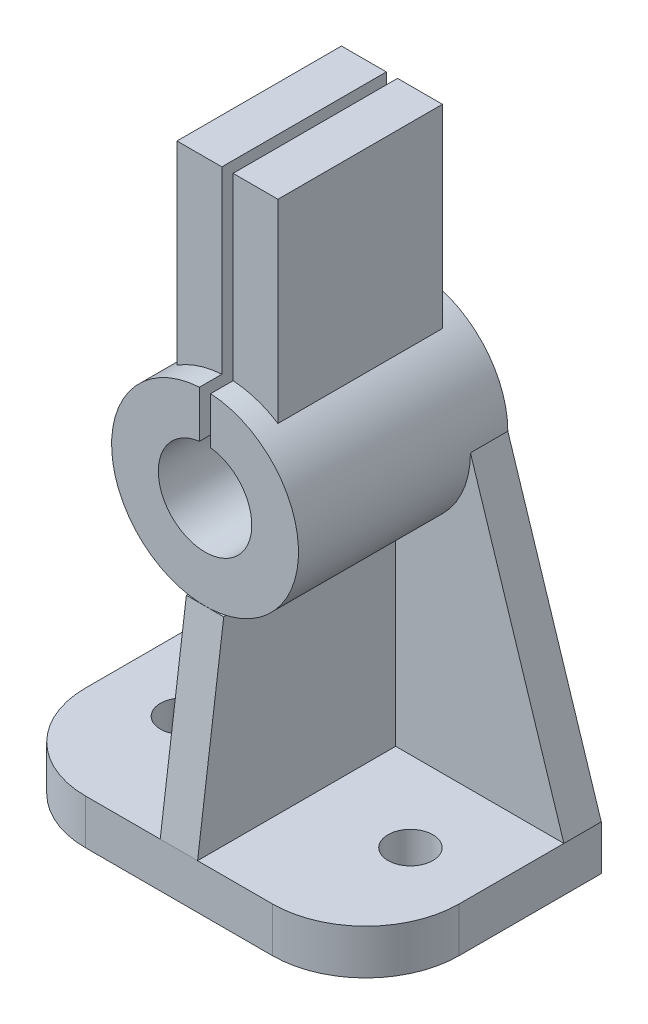
ISO-10303-21;
HEADER;
FILE_DESCRIPTION(('STEP AP214'),'2;1');
FILE_NAME('part.step','',(''),(''),'','','');
FILE_SCHEMA(('AUTOMOTIVE_DESIGN { 1 0 10303 214 1 1 1 1 }'));
ENDSEC;
DATA;
#1=APPLICATION_CONTEXT('core data for automotive mechanical design processes');
#2=APPLICATION_PROTOCOL_DEFINITION('international standard','automotive_design',2000,#1);
#3=PRODUCT_CONTEXT('',#1,'mechanical');
#4=PRODUCT('Part','Part','',(#3));
#5=PRODUCT_RELATED_PRODUCT_CATEGORY('part','',(#4));
#6=PRODUCT_DEFINITION_FORMATION('','',#4);
#7=PRODUCT_DEFINITION_CONTEXT('part definition',#1,'design');
#8=PRODUCT_DEFINITION('design','',#6,#7);
#9=PRODUCT_DEFINITION_SHAPE('','',#8);
#10=(LENGTH_UNIT() NAMED_UNIT(*) SI_UNIT(.MILLI.,.METRE.));
#11=(NAMED_UNIT(*) PLANE_ANGLE_UNIT() SI_UNIT($,.RADIAN.));
#12=(NAMED_UNIT(*) SI_UNIT($,.STERADIAN.) SOLID_ANGLE_UNIT());
#13=UNCERTAINTY_MEASURE_WITH_UNIT(LENGTH_MEASURE(1.E-05),#10,'distance_accuracy_value','');
#14=(GEOMETRIC_REPRESENTATION_CONTEXT(3) GLOBAL_UNCERTAINTY_ASSIGNED_CONTEXT((#13)) GLOBAL_UNIT_ASSIGNED_CONTEXT((#10,
#11,#12)) REPRESENTATION_CONTEXT('',''));
#15=CARTESIAN_POINT('',(0.,0.,0.));
#16=DIRECTION('',(0.,0.,1.));
#17=DIRECTION('',(1.,0.,0.));
#18=AXIS2_PLACEMENT_3D('',#15,#16,#17);
#19=CARTESIAN_POINT('',(-5.,65.,-21.5));
#20=DIRECTION('',(0.,-1.,0.));
#21=DIRECTION('',(0.,0.,-1.));
#22=AXIS2_PLACEMENT_3D('',#19,#20,#21);
#23=PLANE('',#22);
#24=DIRECTION('',(0.,0.,-1.));
#25=VECTOR('',#24,1.);
#26=CARTESIAN_POINT('',(5.,65.,-21.5));
#27=LINE('',#26,#25);
#28=CARTESIAN_POINT('',(5.,65.,24.5));
#29=VERTEX_POINT('',#28);
#30=CARTESIAN_POINT('',(5.,65.,-21.5));
#31=VERTEX_POINT('',#30);
#32=EDGE_CURVE('E106',#29,#31,#27,.T.);
#33=ORIENTED_EDGE('',*,*,#32,.T.);
#34=DIRECTION('',(1.,0.,0.));
#35=VECTOR('',#34,1.);
#36=CARTESIAN_POINT('',(-5.,65.,-21.5));
#37=LINE('',#36,#35);
#38=CARTESIAN_POINT('',(-5.,65.,-21.5));
#39=VERTEX_POINT('',#38);
#40=EDGE_CURVE('E12',#39,#31,#37,.T.);
#41=ORIENTED_EDGE('',*,*,#40,.F.);
#42=DIRECTION('',(0.,0.,-1.));
#43=VECTOR('',#42,1.);
#44=CARTESIAN_POINT('',(-5.,65.,-21.5));
#45=LINE('',#44,#43);
#46=CARTESIAN_POINT('',(-5.,65.,24.5));
#47=VERTEX_POINT('',#46);
#48=EDGE_CURVE('E94',#47,#39,#45,.T.);
#49=ORIENTED_EDGE('',*,*,#48,.F.);
#50=DIRECTION('',(1.,0.,0.));
#51=VECTOR('',#50,1.);
#52=CARTESIAN_POINT('',(-5.,65.,24.5));
#53=LINE('',#52,#51);
#54=EDGE_CURVE('E102',#47,#29,#53,.T.);
#55=ORIENTED_EDGE('',*,*,#54,.T.);
#56=EDGE_LOOP('',(#33,#41,#49,#55));
#57=FACE_BOUND('',#56,.T.);
#58=ADVANCED_FACE('F43',(#57),#23,.F.);
#59=CARTESIAN_POINT('',(-5.,12.,-21.5));
#60=DIRECTION('',(0.,0.,1.));
#61=DIRECTION('',(0.,-1.,0.));
#62=AXIS2_PLACEMENT_3D('',#59,#60,#61);
#63=PLANE('',#62);
#64=DIRECTION('',(0.,-1.,0.));
#65=VECTOR('',#64,1.);
#66=CARTESIAN_POINT('',(5.,12.,-21.5));
#67=LINE('',#66,#65);
#68=CARTESIAN_POINT('',(5.,12.,-21.5));
#69=VERTEX_POINT('',#68);
#70=EDGE_CURVE('E98',#31,#69,#67,.T.);
#71=ORIENTED_EDGE('',*,*,#70,.T.);
#72=DIRECTION('',(1.,0.,0.));
#73=VECTOR('',#72,1.);
#74=CARTESIAN_POINT('',(-5.,12.,-21.5));
#75=LINE('',#74,#73);
#76=CARTESIAN_POINT('',(-5.,12.,-21.5));
#77=VERTEX_POINT('',#76);
#78=EDGE_CURVE('E51',#77,#69,#75,.T.);
#79=ORIENTED_EDGE('',*,*,#78,.F.);
#80=DIRECTION('',(0.,-1.,0.));
#81=VECTOR('',#80,1.);
#82=CARTESIAN_POINT('',(-5.,12.,-21.5));
#83=LINE('',#82,#81);
#84=EDGE_CURVE('E89',#39,#77,#83,.T.);
#85=ORIENTED_EDGE('',*,*,#84,.F.);
#86=ORIENTED_EDGE('',*,*,#40,.T.);
#87=EDGE_LOOP('',(#71,#79,#85,#86));
#88=FACE_BOUND('',#87,.T.);
#89=ADVANCED_FACE('F97',(#88),#63,.F.);
#90=CARTESIAN_POINT('',(-5.,12.,31.5));
#91=DIRECTION('',(0.,1.,0.));
#92=DIRECTION('',(0.,0.,1.));
#93=AXIS2_PLACEMENT_3D('',#90,#91,#92);
#94=PLANE('',#93);
#95=DIRECTION('',(0.,0.,1.));
#96=VECTOR('',#95,1.);
#97=CARTESIAN_POINT('',(5.,12.,31.5));
#98=LINE('',#97,#96);
#99=CARTESIAN_POINT('',(5.,12.,31.5));
#100=VERTEX_POINT('',#99);
#101=EDGE_CURVE('E76',#69,#100,#98,.T.);
#102=ORIENTED_EDGE('',*,*,#101,.T.);
#103=DIRECTION('',(1.,0.,0.));
#104=VECTOR('',#103,1.);
#105=CARTESIAN_POINT('',(-5.,12.,31.5));
#106=LINE('',#105,#104);
#107=CARTESIAN_POINT('',(-5.,12.,31.5));
#108=VERTEX_POINT('',#107);
#109=EDGE_CURVE('E99',#108,#100,#106,.T.);
#110=ORIENTED_EDGE('',*,*,#109,.F.);
#111=DIRECTION('',(0.,0.,1.));
#112=VECTOR('',#111,1.);
#113=CARTESIAN_POINT('',(-5.,12.,31.5));
#114=LINE('',#113,#112);
#115=EDGE_CURVE('E92',#77,#108,#114,.T.);
#116=ORIENTED_EDGE('',*,*,#115,.F.);
#117=ORIENTED_EDGE('',*,*,#78,.T.);
#118=EDGE_LOOP('',(#102,#110,#116,#117));
#119=FACE_BOUND('',#118,.T.);
#120=ADVANCED_FACE('F100',(#119),#94,.F.);
#121=CARTESIAN_POINT('',(-5.,65.,24.5));
#122=DIRECTION('',(0.,-0.130938369254535,-0.991390510070055));
#123=DIRECTION('',(0.,0.991390510070055,-0.130938369254535));
#124=AXIS2_PLACEMENT_3D('',#121,#122,#123);
#125=PLANE('',#124);
#126=DIRECTION('',(0.,0.991390510070055,-0.130938369254535));
#127=VECTOR('',#126,1.);
#128=CARTESIAN_POINT('',(5.,65.,24.5));
#129=LINE('',#128,#127);
#130=EDGE_CURVE('E82',#100,#29,#129,.T.);
#131=ORIENTED_EDGE('',*,*,#130,.T.);
#132=ORIENTED_EDGE('',*,*,#54,.F.);
#133=DIRECTION('',(0.,0.991390510070055,-0.130938369254535));
#134=VECTOR('',#133,1.);
#135=CARTESIAN_POINT('',(-5.,65.,24.5));
#136=LINE('',#135,#134);
#137=EDGE_CURVE('E59',#108,#47,#136,.T.);
#138=ORIENTED_EDGE('',*,*,#137,.F.);
#139=ORIENTED_EDGE('',*,*,#109,.T.);
#140=EDGE_LOOP('',(#131,#132,#138,#139));
#141=FACE_BOUND('',#140,.T.);
#142=ADVANCED_FACE('F113',(#141),#125,.F.);
#143=CARTESIAN_POINT('',(-5.,0.,0.));
#144=DIRECTION('',(-1.,0.,0.));
#145=DIRECTION('',(0.,0.,1.));
#146=AXIS2_PLACEMENT_3D('',#143,#144,#145);
#147=PLANE('',#146);
#148=ORIENTED_EDGE('',*,*,#48,.T.);
#149=ORIENTED_EDGE('',*,*,#84,.T.);
#150=ORIENTED_EDGE('',*,*,#115,.T.);
#151=ORIENTED_EDGE('',*,*,#137,.T.);
#152=EDGE_LOOP('',(#148,#149,#150,#151));
#153=FACE_BOUND('',#152,.T.);
#154=ADVANCED_FACE('F90',(#153),#147,.T.);
#155=CARTESIAN_POINT('',(5.,0.,0.));
#156=DIRECTION('',(-1.,0.,0.));
#157=DIRECTION('',(0.,0.,1.));
#158=AXIS2_PLACEMENT_3D('',#155,#156,#157);
#159=PLANE('',#158);
#160=ORIENTED_EDGE('',*,*,#32,.F.);
#161=ORIENTED_EDGE('',*,*,#130,.F.);
#162=ORIENTED_EDGE('',*,*,#101,.F.);
#163=ORIENTED_EDGE('',*,*,#70,.F.);
#164=EDGE_LOOP('',(#160,#161,#162,#163));
#165=FACE_BOUND('',#164,.T.);
#166=ADVANCED_FACE('F116',(#165),#159,.F.);
#167=CLOSED_SHELL('',(#58,#89,#120,#142,#154,#166));
#168=MANIFOLD_SOLID_BREP('B2',#167);
#169=CARTESIAN_POINT('',(-13.5,-0.002000000000002,-25.5));
#170=DIRECTION('',(0.,0.,1.));
#171=DIRECTION('',(1.,0.,0.));
#172=AXIS2_PLACEMENT_3D('',#169,#170,#171);
#173=PLANE('',#172);
#174=DIRECTION('',(-1.,0.,0.));
#175=VECTOR('',#174,1.);
#176=CARTESIAN_POINT('',(-13.5,163.,-25.5));
#177=LINE('',#176,#175);
#178=CARTESIAN_POINT('',(-1.5,163.,-25.5));
#179=VERTEX_POINT('',#178);
#180=CARTESIAN_POINT('',(-13.5,163.,-25.5));
#181=VERTEX_POINT('',#180);
#182=EDGE_CURVE('E379',#179,#181,#177,.T.);
#183=ORIENTED_EDGE('',*,*,#182,.F.);
#184=DIRECTION('',(0.,-1.,0.));
#185=VECTOR('',#184,1.);
#186=CARTESIAN_POINT('',(-1.5,-0.002000000000002,-25.5));
#187=LINE('',#186,#185);
#188=CARTESIAN_POINT('',(-1.5,114.954959426936,-25.5));
#189=VERTEX_POINT('',#188);
#190=EDGE_CURVE('E364',#179,#189,#187,.T.);
#191=ORIENTED_EDGE('',*,*,#190,.T.);
#192=CARTESIAN_POINT('',(0.,90.,-25.5));
#193=DIRECTION('',(0.,0.,1.));
#194=DIRECTION('',(1.,0.,0.));
#195=AXIS2_PLACEMENT_3D('',#192,#193,#194);
#196=CIRCLE('',#195,25.);
#197=CARTESIAN_POINT('',(-13.5,111.041625412501,-25.5));
#198=VERTEX_POINT('',#197);
#199=EDGE_CURVE('E394',#189,#198,#196,.T.);
#200=ORIENTED_EDGE('',*,*,#199,.T.);
#201=DIRECTION('',(0.,1.,0.));
#202=VECTOR('',#201,1.);
#203=CARTESIAN_POINT('',(-13.5,-0.002000000000002,-25.5));
#204=LINE('',#203,#202);
#205=EDGE_CURVE('E389',#198,#181,#204,.T.);
#206=ORIENTED_EDGE('',*,*,#205,.T.);
#207=EDGE_LOOP('',(#183,#191,#200,#206));
#208=FACE_BOUND('',#207,.T.);
#209=ADVANCED_FACE('F167',(#208),#173,.F.);
#210=CARTESIAN_POINT('',(13.5,-0.002000000000002,18.5));
#211=DIRECTION('',(0.,0.,-1.));
#212=DIRECTION('',(-1.,0.,0.));
#213=AXIS2_PLACEMENT_3D('',#210,#211,#212);
#214=PLANE('',#213);
#215=CARTESIAN_POINT('',(0.,90.,18.5));
#216=DIRECTION('',(0.,0.,-1.));
#217=DIRECTION('',(-1.,0.,0.));
#218=AXIS2_PLACEMENT_3D('',#215,#216,#217);
#219=CIRCLE('',#218,25.);
#220=CARTESIAN_POINT('',(-13.5,111.041625412501,18.5));
#221=VERTEX_POINT('',#220);
#222=CARTESIAN_POINT('',(-1.5,114.954959426936,18.5));
#223=VERTEX_POINT('',#222);
#224=EDGE_CURVE('E401',#221,#223,#219,.T.);
#225=ORIENTED_EDGE('',*,*,#224,.T.);
#226=DIRECTION('',(0.,1.,0.));
#227=VECTOR('',#226,1.);
#228=CARTESIAN_POINT('',(-1.5,-0.002000000000002,18.5));
#229=LINE('',#228,#227);
#230=CARTESIAN_POINT('',(-1.5,163.,18.5));
#231=VERTEX_POINT('',#230);
#232=EDGE_CURVE('E355',#223,#231,#229,.T.);
#233=ORIENTED_EDGE('',*,*,#232,.T.);
#234=DIRECTION('',(1.,0.,0.));
#235=VECTOR('',#234,1.);
#236=CARTESIAN_POINT('',(-13.5,163.,18.5));
#237=LINE('',#236,#235);
#238=CARTESIAN_POINT('',(-13.5,163.,18.5));
#239=VERTEX_POINT('',#238);
#240=EDGE_CURVE('E374',#239,#231,#237,.T.);
#241=ORIENTED_EDGE('',*,*,#240,.F.);
#242=DIRECTION('',(0.,1.,0.));
#243=VECTOR('',#242,1.);
#244=CARTESIAN_POINT('',(-13.5,-0.002000000000002,18.5));
#245=LINE('',#244,#243);
#246=EDGE_CURVE('E392',#221,#239,#245,.T.);
#247=ORIENTED_EDGE('',*,*,#246,.F.);
#248=EDGE_LOOP('',(#225,#233,#241,#247));
#249=FACE_BOUND('',#248,.T.);
#250=ADVANCED_FACE('F554',(#249),#214,.F.);
#251=CARTESIAN_POINT('',(0.,163.,0.));
#252=DIRECTION('',(0.,1.,0.));
#253=DIRECTION('',(0.,0.,1.));
#254=AXIS2_PLACEMENT_3D('',#251,#252,#253);
#255=PLANE('',#254);
#256=DIRECTION('',(0.,0.,1.));
#257=VECTOR('',#256,1.);
#258=CARTESIAN_POINT('',(-1.5,163.,0.));
#259=LINE('',#258,#257);
#260=EDGE_CURVE('E41',#179,#231,#259,.T.);
#261=ORIENTED_EDGE('',*,*,#260,.F.);
#262=ORIENTED_EDGE('',*,*,#182,.T.);
#263=DIRECTION('',(0.,0.,1.));
#264=VECTOR('',#263,1.);
#265=CARTESIAN_POINT('',(-13.5,163.,-25.5));
#266=LINE('',#265,#264);
#267=EDGE_CURVE('E370',#181,#239,#266,.T.);
#268=ORIENTED_EDGE('',*,*,#267,.T.);
#269=ORIENTED_EDGE('',*,*,#240,.T.);
#270=EDGE_LOOP('',(#261,#262,#268,#269));
#271=FACE_BOUND('',#270,.T.);
#272=ADVANCED_FACE('F550',(#271),#255,.T.);
#273=CARTESIAN_POINT('',(0.,90.,-21.5));
#274=DIRECTION('',(0.,0.,-1.));
#275=DIRECTION('',(-1.,0.,0.));
#276=AXIS2_PLACEMENT_3D('',#273,#274,#275);
#277=CYLINDRICAL_SURFACE('',#276,25.);
#278=DIRECTION('',(0.,0.,-1.));
#279=VECTOR('',#278,1.);
#280=CARTESIAN_POINT('',(-1.5,114.954959426936,-21.5));
#281=LINE('',#280,#279);
#282=CARTESIAN_POINT('',(-1.5,114.954959426936,-31.5));
#283=VERTEX_POINT('',#282);
#284=EDGE_CURVE('E361',#283,#189,#281,.F.);
#285=ORIENTED_EDGE('',*,*,#284,.F.);
#286=CARTESIAN_POINT('',(0.,90.,-31.5));
#287=DIRECTION('',(0.,0.,-1.));
#288=DIRECTION('',(-1.,0.,0.));
#289=AXIS2_PLACEMENT_3D('',#286,#287,#288);
#290=CIRCLE('',#289,25.);
#291=CARTESIAN_POINT('',(-25.,90.,-31.5));
#292=VERTEX_POINT('',#291);
#293=EDGE_CURVE('E340',#292,#283,#290,.T.);
#294=ORIENTED_EDGE('',*,*,#293,.F.);
#295=DIRECTION('',(0.,0.,-1.));
#296=VECTOR('',#295,1.);
#297=CARTESIAN_POINT('',(-25.,90.,-21.5));
#298=LINE('',#297,#296);
#299=CARTESIAN_POINT('',(-25.,90.,-21.5));
#300=VERTEX_POINT('',#299);
#301=EDGE_CURVE('E437',#300,#292,#298,.T.);
#302=ORIENTED_EDGE('',*,*,#301,.F.);
#303=CARTESIAN_POINT('',(0.,90.,-21.5));
#304=DIRECTION('',(0.,0.,-1.));
#305=DIRECTION('',(-1.,0.,0.));
#306=AXIS2_PLACEMENT_3D('',#303,#304,#305);
#307=CIRCLE('',#306,25.);
#308=CARTESIAN_POINT('',(25.,90.,-21.5));
#309=VERTEX_POINT('',#308);
#310=EDGE_CURVE('E489',#309,#300,#307,.T.);
#311=ORIENTED_EDGE('',*,*,#310,.F.);
#312=DIRECTION('',(0.,0.,-1.));
#313=VECTOR('',#312,1.);
#314=CARTESIAN_POINT('',(25.,90.,-21.5));
#315=LINE('',#314,#313);
#316=CARTESIAN_POINT('',(25.,90.,-31.5));
#317=VERTEX_POINT('',#316);
#318=EDGE_CURVE('E431',#309,#317,#315,.T.);
#319=ORIENTED_EDGE('',*,*,#318,.T.);
#320=CARTESIAN_POINT('',(1.5,114.954959426936,-31.5));
#321=VERTEX_POINT('',#320);
#322=EDGE_CURVE('E422',#321,#317,#290,.T.);
#323=ORIENTED_EDGE('',*,*,#322,.F.);
#324=DIRECTION('',(0.,0.,-1.));
#325=VECTOR('',#324,1.);
#326=CARTESIAN_POINT('',(1.5,114.954959426936,-21.5));
#327=LINE('',#326,#325);
#328=CARTESIAN_POINT('',(1.5,114.954959426936,-25.5));
#329=VERTEX_POINT('',#328);
#330=EDGE_CURVE('E349',#329,#321,#327,.T.);
#331=ORIENTED_EDGE('',*,*,#330,.F.);
#332=CARTESIAN_POINT('',(13.5,111.041625412501,-25.5));
#333=VERTEX_POINT('',#332);
#334=EDGE_CURVE('E395',#333,#329,#196,.T.);
#335=ORIENTED_EDGE('',*,*,#334,.F.);
#336=DIRECTION('',(0.,0.,-1.));
#337=VECTOR('',#336,1.);
#338=CARTESIAN_POINT('',(13.5,111.041625412501,-21.5));
#339=LINE('',#338,#337);
#340=CARTESIAN_POINT('',(13.5,111.041625412501,18.5));
#341=VERTEX_POINT('',#340);
#342=EDGE_CURVE('E367',#341,#333,#339,.T.);
#343=ORIENTED_EDGE('',*,*,#342,.F.);
#344=CARTESIAN_POINT('',(1.5,114.954959426936,18.5));
#345=VERTEX_POINT('',#344);
#346=EDGE_CURVE('E400',#345,#341,#219,.T.);
#347=ORIENTED_EDGE('',*,*,#346,.F.);
#348=CARTESIAN_POINT('',(1.5,114.954959426936,24.5));
#349=VERTEX_POINT('',#348);
#350=EDGE_CURVE('E346',#349,#345,#327,.T.);
#351=ORIENTED_EDGE('',*,*,#350,.F.);
#352=CARTESIAN_POINT('',(0.,90.,24.5));
#353=DIRECTION('',(0.,0.,-1.));
#354=DIRECTION('',(-1.,0.,0.));
#355=AXIS2_PLACEMENT_3D('',#352,#353,#354);
#356=CIRCLE('',#355,25.);
#357=CARTESIAN_POINT('',(-1.5,114.954959426936,24.5));
#358=VERTEX_POINT('',#357);
#359=EDGE_CURVE('E419',#349,#358,#356,.T.);
#360=ORIENTED_EDGE('',*,*,#359,.T.);
#361=EDGE_CURVE('E358',#223,#358,#281,.F.);
#362=ORIENTED_EDGE('',*,*,#361,.F.);
#363=ORIENTED_EDGE('',*,*,#224,.F.);
#364=DIRECTION('',(0.,0.,-1.));
#365=VECTOR('',#364,1.);
#366=CARTESIAN_POINT('',(-13.5,111.041625412501,-21.5));
#367=LINE('',#366,#365);
#368=EDGE_CURVE('E398',#198,#221,#367,.F.);
#369=ORIENTED_EDGE('',*,*,#368,.F.);
#370=ORIENTED_EDGE('',*,*,#199,.F.);
#371=EDGE_LOOP('',(#285,#294,#302,#311,#319,#323,#331,#335,#343,#347,#351,#360,#362,#363,#369,#370));
#372=FACE_BOUND('',#371,.T.);
#373=ADVANCED_FACE('F506',(#372),#277,.T.);
#374=CARTESIAN_POINT('',(50.,12.,6.49999999999982));
#375=DIRECTION('',(-1.,0.,0.));
#376=DIRECTION('',(0.,0.,1.));
#377=AXIS2_PLACEMENT_3D('',#374,#375,#376);
#378=PLANE('',#377);
#379=DIRECTION('',(0.,0.,-1.));
#380=VECTOR('',#379,1.);
#381=CARTESIAN_POINT('',(50.,0.,6.49999999999982));
#382=LINE('',#381,#380);
#383=CARTESIAN_POINT('',(50.,0.,6.49999999999983));
#384=VERTEX_POINT('',#383);
#385=CARTESIAN_POINT('',(50.,0.,-31.5));
#386=VERTEX_POINT('',#385);
#387=EDGE_CURVE('E439',#384,#386,#382,.T.);
#388=ORIENTED_EDGE('',*,*,#387,.T.);
#389=DIRECTION('',(0.,-1.,0.));
#390=VECTOR('',#389,1.);
#391=CARTESIAN_POINT('',(50.,12.,-31.5));
#392=LINE('',#391,#390);
#393=CARTESIAN_POINT('',(50.,12.,-31.5));
#394=VERTEX_POINT('',#393);
#395=EDGE_CURVE('E483',#394,#386,#392,.T.);
#396=ORIENTED_EDGE('',*,*,#395,.F.);
#397=DIRECTION('',(0.,0.,-1.));
#398=VECTOR('',#397,1.);
#399=CARTESIAN_POINT('',(50.,12.,-21.5));
#400=LINE('',#399,#398);
#401=CARTESIAN_POINT('',(50.,12.,-21.5));
#402=VERTEX_POINT('',#401);
#403=EDGE_CURVE('E440',#402,#394,#400,.T.);
#404=ORIENTED_EDGE('',*,*,#403,.F.);
#405=DIRECTION('',(0.,0.,-1.));
#406=VECTOR('',#405,1.);
#407=CARTESIAN_POINT('',(50.,12.,6.49999999999982));
#408=LINE('',#407,#406);
#409=CARTESIAN_POINT('',(50.,12.,6.49999999999983));
#410=VERTEX_POINT('',#409);
#411=EDGE_CURVE('E444',#410,#402,#408,.T.);
#412=ORIENTED_EDGE('',*,*,#411,.F.);
#413=DIRECTION('',(0.,-1.,0.));
#414=VECTOR('',#413,1.);
#415=CARTESIAN_POINT('',(50.,12.,6.49999999999983));
#416=LINE('',#415,#414);
#417=EDGE_CURVE('E457',#410,#384,#416,.T.);
#418=ORIENTED_EDGE('',*,*,#417,.T.);
#419=EDGE_LOOP('',(#388,#396,#404,#412,#418));
#420=FACE_BOUND('',#419,.T.);
#421=ADVANCED_FACE('F169',(#420),#378,.F.);
#422=CARTESIAN_POINT('',(-50.,12.,-31.5));
#423=DIRECTION('',(0.,0.,1.));
#424=DIRECTION('',(1.,0.,0.));
#425=AXIS2_PLACEMENT_3D('',#422,#423,#424);
#426=PLANE('',#425);
#427=ORIENTED_EDGE('',*,*,#293,.T.);
#428=DIRECTION('',(0.,1.,0.));
#429=VECTOR('',#428,1.);
#430=CARTESIAN_POINT('',(-1.5,-0.001000000000001,-31.5));
#431=LINE('',#430,#429);
#432=CARTESIAN_POINT('',(-1.5,102.409673645991,-31.5));
#433=VERTEX_POINT('',#432);
#434=EDGE_CURVE('E318',#433,#283,#431,.T.);
#435=ORIENTED_EDGE('',*,*,#434,.F.);
#436=CARTESIAN_POINT('',(0.,90.,-31.5));
#437=DIRECTION('',(0.,0.,-1.));
#438=DIRECTION('',(-1.,0.,0.));
#439=AXIS2_PLACEMENT_3D('',#436,#437,#438);
#440=CIRCLE('',#439,12.5);
#441=CARTESIAN_POINT('',(1.50000000000001,102.409673645991,-31.5));
#442=VERTEX_POINT('',#441);
#443=EDGE_CURVE('E327',#433,#442,#440,.T.);
#444=ORIENTED_EDGE('',*,*,#443,.T.);
#445=DIRECTION('',(0.,1.,0.));
#446=VECTOR('',#445,1.);
#447=CARTESIAN_POINT('',(1.5,-0.001000000000001,-31.5));
#448=LINE('',#447,#446);
#449=EDGE_CURVE('E324',#442,#321,#448,.T.);
#450=ORIENTED_EDGE('',*,*,#449,.T.);
#451=ORIENTED_EDGE('',*,*,#322,.T.);
#452=DIRECTION('',(0.305218682064767,-0.952282288042073,0.));
#453=VECTOR('',#452,1.);
#454=CARTESIAN_POINT('',(25.,90.,-31.5));
#455=LINE('',#454,#453);
#456=EDGE_CURVE('E433',#317,#394,#455,.T.);
#457=ORIENTED_EDGE('',*,*,#456,.T.);
#458=ORIENTED_EDGE('',*,*,#395,.T.);
#459=DIRECTION('',(-1.,0.,0.));
#460=VECTOR('',#459,1.);
#461=CARTESIAN_POINT('',(-50.,0.,-31.5));
#462=LINE('',#461,#460);
#463=CARTESIAN_POINT('',(-50.,0.,-31.5));
#464=VERTEX_POINT('',#463);
#465=EDGE_CURVE('E460',#386,#464,#462,.T.);
#466=ORIENTED_EDGE('',*,*,#465,.T.);
#467=DIRECTION('',(0.,-1.,0.));
#468=VECTOR('',#467,1.);
#469=CARTESIAN_POINT('',(-50.,12.,-31.5));
#470=LINE('',#469,#468);
#471=CARTESIAN_POINT('',(-50.,12.,-31.5));
#472=VERTEX_POINT('',#471);
#473=EDGE_CURVE('E480',#472,#464,#470,.T.);
#474=ORIENTED_EDGE('',*,*,#473,.F.);
#475=DIRECTION('',(0.305218682064767,0.952282288042073,0.));
#476=VECTOR('',#475,1.);
#477=CARTESIAN_POINT('',(-50.,12.,-31.5));
#478=LINE('',#477,#476);
#479=EDGE_CURVE('E427',#472,#292,#478,.T.);
#480=ORIENTED_EDGE('',*,*,#479,.T.);
#481=EDGE_LOOP('',(#427,#435,#444,#450,#451,#457,#458,#466,#474,#480));
#482=FACE_BOUND('',#481,.T.);
#483=ADVANCED_FACE('F337',(#482),#426,.F.);
#484=CARTESIAN_POINT('',(-50.,12.,6.49999999999982));
#485=DIRECTION('',(1.,0.,0.));
#486=DIRECTION('',(0.,0.,-1.));
#487=AXIS2_PLACEMENT_3D('',#484,#485,#486);
#488=PLANE('',#487);
#489=DIRECTION('',(0.,0.,1.));
#490=VECTOR('',#489,1.);
#491=CARTESIAN_POINT('',(-50.,0.,6.49999999999982));
#492=LINE('',#491,#490);
#493=CARTESIAN_POINT('',(-50.,0.,6.49999999999982));
#494=VERTEX_POINT('',#493);
#495=EDGE_CURVE('E462',#464,#494,#492,.T.);
#496=ORIENTED_EDGE('',*,*,#495,.T.);
#497=DIRECTION('',(0.,-1.,0.));
#498=VECTOR('',#497,1.);
#499=CARTESIAN_POINT('',(-50.,12.,6.49999999999982));
#500=LINE('',#499,#498);
#501=CARTESIAN_POINT('',(-50.,12.,6.49999999999982));
#502=VERTEX_POINT('',#501);
#503=EDGE_CURVE('E477',#502,#494,#500,.T.);
#504=ORIENTED_EDGE('',*,*,#503,.F.);
#505=DIRECTION('',(0.,0.,1.));
#506=VECTOR('',#505,1.);
#507=CARTESIAN_POINT('',(-50.,12.,6.49999999999982));
#508=LINE('',#507,#506);
#509=CARTESIAN_POINT('',(-50.,12.,-21.5));
#510=VERTEX_POINT('',#509);
#511=EDGE_CURVE('E447',#510,#502,#508,.T.);
#512=ORIENTED_EDGE('',*,*,#511,.F.);
#513=EDGE_CURVE('E449',#472,#510,#508,.T.);
#514=ORIENTED_EDGE('',*,*,#513,.F.);
#515=ORIENTED_EDGE('',*,*,#473,.T.);
#516=EDGE_LOOP('',(#496,#504,#512,#514,#515));
#517=FACE_BOUND('',#516,.T.);
#518=ADVANCED_FACE('F538',(#517),#488,.F.);
#519=CARTESIAN_POINT('',(-25.,12.,6.5));
#520=DIRECTION('',(0.,-1.,0.));
#521=DIRECTION('',(0.,0.,-1.));
#522=AXIS2_PLACEMENT_3D('',#519,#520,#521);
#523=CYLINDRICAL_SURFACE('',#522,25.);
#524=CARTESIAN_POINT('',(-25.,0.,6.5));
#525=DIRECTION('',(0.,1.,0.));
#526=DIRECTION('',(0.,0.,-1.));
#527=AXIS2_PLACEMENT_3D('',#524,#525,#526);
#528=CIRCLE('',#527,25.);
#529=CARTESIAN_POINT('',(-24.9999999999998,0.,31.5));
#530=VERTEX_POINT('',#529);
#531=EDGE_CURVE('E464',#494,#530,#528,.T.);
#532=ORIENTED_EDGE('',*,*,#531,.T.);
#533=DIRECTION('',(0.,-1.,0.));
#534=VECTOR('',#533,1.);
#535=CARTESIAN_POINT('',(-24.9999999999998,12.,31.5));
#536=LINE('',#535,#534);
#537=CARTESIAN_POINT('',(-24.9999999999998,12.,31.5));
#538=VERTEX_POINT('',#537);
#539=EDGE_CURVE('E474',#538,#530,#536,.T.);
#540=ORIENTED_EDGE('',*,*,#539,.F.);
#541=CARTESIAN_POINT('',(-25.,12.,6.5));
#542=DIRECTION('',(0.,1.,0.));
#543=DIRECTION('',(0.,0.,-1.));
#544=AXIS2_PLACEMENT_3D('',#541,#542,#543);
#545=CIRCLE('',#544,25.);
#546=EDGE_CURVE('E451',#502,#538,#545,.T.);
#547=ORIENTED_EDGE('',*,*,#546,.F.);
#548=ORIENTED_EDGE('',*,*,#503,.T.);
#549=EDGE_LOOP('',(#532,#540,#547,#548));
#550=FACE_BOUND('',#549,.T.);
#551=ADVANCED_FACE('F625',(#550),#523,.T.);
#552=CARTESIAN_POINT('',(-24.9999999999998,12.,31.5));
#553=DIRECTION('',(0.,0.,-1.));
#554=DIRECTION('',(-1.,0.,0.));
#555=AXIS2_PLACEMENT_3D('',#552,#553,#554);
#556=PLANE('',#555);
#557=DIRECTION('',(1.,0.,0.));
#558=VECTOR('',#557,1.);
#559=CARTESIAN_POINT('',(-24.9999999999998,0.,31.5));
#560=LINE('',#559,#558);
#561=CARTESIAN_POINT('',(24.9999999999998,0.,31.5));
#562=VERTEX_POINT('',#561);
#563=EDGE_CURVE('E466',#530,#562,#560,.T.);
#564=ORIENTED_EDGE('',*,*,#563,.T.);
#565=DIRECTION('',(0.,-1.,0.));
#566=VECTOR('',#565,1.);
#567=CARTESIAN_POINT('',(24.9999999999998,12.,31.5));
#568=LINE('',#567,#566);
#569=CARTESIAN_POINT('',(24.9999999999998,12.,31.5));
#570=VERTEX_POINT('',#569);
#571=EDGE_CURVE('E471',#570,#562,#568,.T.);
#572=ORIENTED_EDGE('',*,*,#571,.F.);
#573=DIRECTION('',(1.,0.,0.));
#574=VECTOR('',#573,1.);
#575=CARTESIAN_POINT('',(-24.9999999999998,12.,31.5));
#576=LINE('',#575,#574);
#577=EDGE_CURVE('E453',#538,#570,#576,.T.);
#578=ORIENTED_EDGE('',*,*,#577,.F.);
#579=ORIENTED_EDGE('',*,*,#539,.T.);
#580=EDGE_LOOP('',(#564,#572,#578,#579));
#581=FACE_BOUND('',#580,.T.);
#582=ADVANCED_FACE('F622',(#581),#556,.F.);
#583=CARTESIAN_POINT('',(25.,12.,6.5));
#584=DIRECTION('',(0.,-1.,0.));
#585=DIRECTION('',(0.,0.,-1.));
#586=AXIS2_PLACEMENT_3D('',#583,#584,#585);
#587=CYLINDRICAL_SURFACE('',#586,25.);
#588=CARTESIAN_POINT('',(25.,0.,6.5));
#589=DIRECTION('',(0.,1.,0.));
#590=DIRECTION('',(0.,0.,1.));
#591=AXIS2_PLACEMENT_3D('',#588,#589,#590);
#592=CIRCLE('',#591,25.);
#593=EDGE_CURVE('E448',#562,#384,#592,.T.);
#594=ORIENTED_EDGE('',*,*,#593,.T.);
#595=ORIENTED_EDGE('',*,*,#417,.F.);
#596=CARTESIAN_POINT('',(25.,12.,6.5));
#597=DIRECTION('',(0.,1.,0.));
#598=DIRECTION('',(0.,0.,1.));
#599=AXIS2_PLACEMENT_3D('',#596,#597,#598);
#600=CIRCLE('',#599,25.);
#601=EDGE_CURVE('E455',#570,#410,#600,.T.);
#602=ORIENTED_EDGE('',*,*,#601,.F.);
#603=ORIENTED_EDGE('',*,*,#571,.T.);
#604=EDGE_LOOP('',(#594,#595,#602,#603));
#605=FACE_BOUND('',#604,.T.);
#606=ADVANCED_FACE('F527',(#605),#587,.T.);
#607=CARTESIAN_POINT('',(-25.,12.,6.5));
#608=DIRECTION('',(0.,-1.,0.));
#609=DIRECTION('',(0.,0.,-1.));
#610=AXIS2_PLACEMENT_3D('',#607,#608,#609);
#611=PLANE('',#610);
#612=CARTESIAN_POINT('',(30.4429970969628,12.,0.));
#613=DIRECTION('',(0.,-1.,0.));
#614=DIRECTION('',(0.,0.,-1.));
#615=AXIS2_PLACEMENT_3D('',#612,#613,#614);
#616=CIRCLE('',#615,6.);
#617=CARTESIAN_POINT('',(30.4429970969628,12.,-6.));
#618=VERTEX_POINT('',#617);
#619=EDGE_CURVE('E405',#618,#618,#616,.F.);
#620=ORIENTED_EDGE('',*,*,#619,.F.);
#621=EDGE_LOOP('',(#620));
#622=FACE_BOUND('',#621,.T.);
#623=CARTESIAN_POINT('',(-30.4429970969628,12.,0.));
#624=DIRECTION('',(0.,-1.,0.));
#625=DIRECTION('',(0.,0.,-1.));
#626=AXIS2_PLACEMENT_3D('',#623,#624,#625);
#627=CIRCLE('',#626,6.);
#628=CARTESIAN_POINT('',(-30.4429970969628,12.,-6.));
#629=VERTEX_POINT('',#628);
#630=EDGE_CURVE('E412',#629,#629,#627,.F.);
#631=ORIENTED_EDGE('',*,*,#630,.F.);
#632=EDGE_LOOP('',(#631));
#633=FACE_BOUND('',#632,.T.);
#634=ORIENTED_EDGE('',*,*,#411,.T.);
#635=DIRECTION('',(-1.,0.,0.));
#636=VECTOR('',#635,1.);
#637=CARTESIAN_POINT('',(50.,12.,-21.5));
#638=LINE('',#637,#636);
#639=EDGE_CURVE('E426',#402,#510,#638,.T.);
#640=ORIENTED_EDGE('',*,*,#639,.T.);
#641=ORIENTED_EDGE('',*,*,#511,.T.);
#642=ORIENTED_EDGE('',*,*,#546,.T.);
#643=ORIENTED_EDGE('',*,*,#577,.T.);
#644=ORIENTED_EDGE('',*,*,#601,.T.);
#645=EDGE_LOOP('',(#634,#640,#641,#642,#643,#644));
#646=FACE_BOUND('',#645,.T.);
#647=ADVANCED_FACE('F520',(#622,#633,#646),#611,.F.);
#648=CARTESIAN_POINT('',(-25.,0.,6.5));
#649=DIRECTION('',(0.,-1.,0.));
#650=DIRECTION('',(0.,0.,-1.));
#651=AXIS2_PLACEMENT_3D('',#648,#649,#650);
#652=PLANE('',#651);
#653=CARTESIAN_POINT('',(30.4429970969628,0.,0.));
#654=DIRECTION('',(0.,-1.,0.));
#655=DIRECTION('',(0.,0.,-1.));
#656=AXIS2_PLACEMENT_3D('',#653,#654,#655);
#657=CIRCLE('',#656,6.);
#658=CARTESIAN_POINT('',(30.4429970969628,0.,-6.));
#659=VERTEX_POINT('',#658);
#660=EDGE_CURVE('E409',#659,#659,#657,.T.);
#661=ORIENTED_EDGE('',*,*,#660,.F.);
#662=EDGE_LOOP('',(#661));
#663=FACE_BOUND('',#662,.T.);
#664=CARTESIAN_POINT('',(-30.4429970969628,0.,0.));
#665=DIRECTION('',(0.,-1.,0.));
#666=DIRECTION('',(0.,0.,1.));
#667=AXIS2_PLACEMENT_3D('',#664,#665,#666);
#668=CIRCLE('',#667,6.);
#669=CARTESIAN_POINT('',(-30.4429970969628,0.,6.));
#670=VERTEX_POINT('',#669);
#671=EDGE_CURVE('E404',#670,#670,#668,.T.);
#672=ORIENTED_EDGE('',*,*,#671,.F.);
#673=EDGE_LOOP('',(#672));
#674=FACE_BOUND('',#673,.T.);
#675=ORIENTED_EDGE('',*,*,#387,.F.);
#676=ORIENTED_EDGE('',*,*,#593,.F.);
#677=ORIENTED_EDGE('',*,*,#563,.F.);
#678=ORIENTED_EDGE('',*,*,#531,.F.);
#679=ORIENTED_EDGE('',*,*,#495,.F.);
#680=ORIENTED_EDGE('',*,*,#465,.F.);
#681=EDGE_LOOP('',(#675,#676,#677,#678,#679,#680));
#682=FACE_BOUND('',#681,.T.);
#683=ADVANCED_FACE('F531',(#663,#674,#682),#652,.T.);
#684=CARTESIAN_POINT('',(-50.,12.,-21.5));
#685=DIRECTION('',(-0.952282288042073,0.305218682064767,0.));
#686=DIRECTION('',(-0.305218682064767,-0.952282288042073,0.));
#687=AXIS2_PLACEMENT_3D('',#684,#685,#686);
#688=PLANE('',#687);
#689=ORIENTED_EDGE('',*,*,#479,.F.);
#690=ORIENTED_EDGE('',*,*,#513,.T.);
#691=DIRECTION('',(0.305218682064767,0.952282288042073,0.));
#692=VECTOR('',#691,1.);
#693=CARTESIAN_POINT('',(-50.,12.,-21.5));
#694=LINE('',#693,#692);
#695=EDGE_CURVE('E190',#510,#300,#694,.T.);
#696=ORIENTED_EDGE('',*,*,#695,.T.);
#697=ORIENTED_EDGE('',*,*,#301,.T.);
#698=EDGE_LOOP('',(#689,#690,#696,#697));
#699=FACE_BOUND('',#698,.T.);
#700=ADVANCED_FACE('F541',(#699),#688,.T.);
#701=CARTESIAN_POINT('',(25.,90.,-21.5));
#702=DIRECTION('',(0.952282288042073,0.305218682064767,0.));
#703=DIRECTION('',(-0.305218682064767,0.952282288042073,0.));
#704=AXIS2_PLACEMENT_3D('',#701,#702,#703);
#705=PLANE('',#704);
#706=ORIENTED_EDGE('',*,*,#456,.F.);
#707=ORIENTED_EDGE('',*,*,#318,.F.);
#708=DIRECTION('',(0.305218682064767,-0.952282288042073,0.));
#709=VECTOR('',#708,1.);
#710=CARTESIAN_POINT('',(25.,90.,-21.5));
#711=LINE('',#710,#709);
#712=EDGE_CURVE('E423',#309,#402,#711,.T.);
#713=ORIENTED_EDGE('',*,*,#712,.T.);
#714=ORIENTED_EDGE('',*,*,#403,.T.);
#715=EDGE_LOOP('',(#706,#707,#713,#714));
#716=FACE_BOUND('',#715,.T.);
#717=ADVANCED_FACE('F515',(#716),#705,.T.);
#718=CARTESIAN_POINT('',(0.,90.,-21.5));
#719=DIRECTION('',(0.,0.,-1.));
#720=DIRECTION('',(-1.,0.,0.));
#721=AXIS2_PLACEMENT_3D('',#718,#719,#720);
#722=PLANE('',#721);
#723=ORIENTED_EDGE('',*,*,#712,.F.);
#724=ORIENTED_EDGE('',*,*,#310,.T.);
#725=ORIENTED_EDGE('',*,*,#695,.F.);
#726=ORIENTED_EDGE('',*,*,#639,.F.);
#727=EDGE_LOOP('',(#723,#724,#725,#726));
#728=FACE_BOUND('',#727,.T.);
#729=ADVANCED_FACE('F603',(#728),#722,.F.);
#730=CARTESIAN_POINT('',(0.,90.,24.5));
#731=DIRECTION('',(0.,0.,-1.));
#732=DIRECTION('',(-1.,0.,0.));
#733=AXIS2_PLACEMENT_3D('',#730,#731,#732);
#734=CYLINDRICAL_SURFACE('',#733,12.5);
#735=CARTESIAN_POINT('',(0.,90.,-21.5));
#736=DIRECTION('',(0.,0.,-1.));
#737=DIRECTION('',(-1.,0.,0.));
#738=AXIS2_PLACEMENT_3D('',#735,#736,#737);
#739=CIRCLE('',#738,12.5);
#740=CARTESIAN_POINT('',(1.50000000000001,102.409673645991,-21.5));
#741=VERTEX_POINT('',#740);
#742=CARTESIAN_POINT('',(-1.5,102.409673645991,-21.5));
#743=VERTEX_POINT('',#742);
#744=EDGE_CURVE('E486',#741,#743,#739,.T.);
#745=ORIENTED_EDGE('',*,*,#744,.T.);
#746=DIRECTION('',(0.,0.,-1.));
#747=VECTOR('',#746,1.);
#748=CARTESIAN_POINT('',(-1.5,102.409673645991,24.5));
#749=LINE('',#748,#747);
#750=CARTESIAN_POINT('',(-1.5,102.409673645991,24.5));
#751=VERTEX_POINT('',#750);
#752=EDGE_CURVE('E321',#751,#743,#749,.T.);
#753=ORIENTED_EDGE('',*,*,#752,.F.);
#754=CARTESIAN_POINT('',(0.,90.,24.5));
#755=DIRECTION('',(0.,0.,-1.));
#756=DIRECTION('',(-1.,0.,0.));
#757=AXIS2_PLACEMENT_3D('',#754,#755,#756);
#758=CIRCLE('',#757,12.5);
#759=CARTESIAN_POINT('',(1.50000000000001,102.409673645991,24.5));
#760=VERTEX_POINT('',#759);
#761=EDGE_CURVE('E408',#760,#751,#758,.T.);
#762=ORIENTED_EDGE('',*,*,#761,.F.);
#763=DIRECTION('',(0.,0.,-1.));
#764=VECTOR('',#763,1.);
#765=CARTESIAN_POINT('',(1.50000000000001,102.409673645991,24.5));
#766=LINE('',#765,#764);
#767=EDGE_CURVE('E334',#741,#760,#766,.F.);
#768=ORIENTED_EDGE('',*,*,#767,.F.);
#769=EDGE_LOOP('',(#745,#753,#762,#768));
#770=FACE_BOUND('',#769,.T.);
#771=ADVANCED_FACE('F563',(#770),#734,.F.);
#772=CARTESIAN_POINT('',(0.,90.,24.5));
#773=DIRECTION('',(0.,0.,-1.));
#774=DIRECTION('',(-1.,0.,0.));
#775=AXIS2_PLACEMENT_3D('',#772,#773,#774);
#776=PLANE('',#775);
#777=ORIENTED_EDGE('',*,*,#761,.T.);
#778=DIRECTION('',(0.,1.,0.));
#779=VECTOR('',#778,1.);
#780=CARTESIAN_POINT('',(-1.5,90.,24.5));
#781=LINE('',#780,#779);
#782=EDGE_CURVE('E360',#751,#358,#781,.T.);
#783=ORIENTED_EDGE('',*,*,#782,.T.);
#784=ORIENTED_EDGE('',*,*,#359,.F.);
#785=DIRECTION('',(0.,-1.,0.));
#786=VECTOR('',#785,1.);
#787=CARTESIAN_POINT('',(1.50000000000001,90.,24.5));
#788=LINE('',#787,#786);
#789=EDGE_CURVE('E348',#349,#760,#788,.T.);
#790=ORIENTED_EDGE('',*,*,#789,.T.);
#791=EDGE_LOOP('',(#777,#783,#784,#790));
#792=FACE_BOUND('',#791,.T.);
#793=ADVANCED_FACE('F559',(#792),#776,.F.);
#794=EDGE_CURVE('E487',#743,#741,#739,.T.);
#795=ORIENTED_EDGE('',*,*,#794,.F.);
#796=ORIENTED_EDGE('',*,*,#744,.F.);
#797=EDGE_LOOP('',(#795,#796));
#798=FACE_BOUND('',#797,.T.);
#799=ADVANCED_FACE('F567',(#798),#722,.F.);
#800=CARTESIAN_POINT('',(-30.4429970969628,115.001,0.));
#801=DIRECTION('',(0.,-1.,0.));
#802=DIRECTION('',(0.,0.,-1.));
#803=AXIS2_PLACEMENT_3D('',#800,#801,#802);
#804=CYLINDRICAL_SURFACE('',#803,6.);
#805=ORIENTED_EDGE('',*,*,#671,.T.);
#806=EDGE_LOOP('',(#805));
#807=FACE_BOUND('',#806,.T.);
#808=ORIENTED_EDGE('',*,*,#630,.T.);
#809=EDGE_LOOP('',(#808));
#810=FACE_BOUND('',#809,.T.);
#811=ADVANCED_FACE('F592',(#807,#810),#804,.F.);
#812=CARTESIAN_POINT('',(30.4429970969628,115.001,0.));
#813=DIRECTION('',(0.,-1.,0.));
#814=DIRECTION('',(0.,0.,-1.));
#815=AXIS2_PLACEMENT_3D('',#812,#813,#814);
#816=CYLINDRICAL_SURFACE('',#815,6.);
#817=ORIENTED_EDGE('',*,*,#660,.T.);
#818=EDGE_LOOP('',(#817));
#819=FACE_BOUND('',#818,.T.);
#820=ORIENTED_EDGE('',*,*,#619,.T.);
#821=EDGE_LOOP('',(#820));
#822=FACE_BOUND('',#821,.T.);
#823=ADVANCED_FACE('F587',(#819,#822),#816,.F.);
#824=CARTESIAN_POINT('',(-13.5,-0.002000000000002,18.5));
#825=DIRECTION('',(1.,0.,0.));
#826=DIRECTION('',(0.,0.,-1.));
#827=AXIS2_PLACEMENT_3D('',#824,#825,#826);
#828=PLANE('',#827);
#829=ORIENTED_EDGE('',*,*,#205,.F.);
#830=ORIENTED_EDGE('',*,*,#368,.T.);
#831=ORIENTED_EDGE('',*,*,#246,.T.);
#832=ORIENTED_EDGE('',*,*,#267,.F.);
#833=EDGE_LOOP('',(#829,#830,#831,#832));
#834=FACE_BOUND('',#833,.T.);
#835=ADVANCED_FACE('F577',(#834),#828,.F.);
#836=ORIENTED_EDGE('',*,*,#334,.T.);
#837=DIRECTION('',(0.,1.,0.));
#838=VECTOR('',#837,1.);
#839=CARTESIAN_POINT('',(1.5,-0.002000000000002,-25.5));
#840=LINE('',#839,#838);
#841=CARTESIAN_POINT('',(1.5,163.,-25.5));
#842=VERTEX_POINT('',#841);
#843=EDGE_CURVE('E352',#329,#842,#840,.T.);
#844=ORIENTED_EDGE('',*,*,#843,.T.);
#845=CARTESIAN_POINT('',(13.5,163.,-25.5));
#846=VERTEX_POINT('',#845);
#847=EDGE_CURVE('E380',#846,#842,#177,.T.);
#848=ORIENTED_EDGE('',*,*,#847,.F.);
#849=DIRECTION('',(0.,-1.,0.));
#850=VECTOR('',#849,1.);
#851=CARTESIAN_POINT('',(13.5,163.,-25.5));
#852=LINE('',#851,#850);
#853=EDGE_CURVE('E383',#846,#333,#852,.T.);
#854=ORIENTED_EDGE('',*,*,#853,.T.);
#855=EDGE_LOOP('',(#836,#844,#848,#854));
#856=FACE_BOUND('',#855,.T.);
#857=ADVANCED_FACE('F496',(#856),#173,.F.);
#858=CARTESIAN_POINT('',(1.5,163.,18.5));
#859=VERTEX_POINT('',#858);
#860=CARTESIAN_POINT('',(13.5,163.,18.5));
#861=VERTEX_POINT('',#860);
#862=EDGE_CURVE('E373',#859,#861,#237,.T.);
#863=ORIENTED_EDGE('',*,*,#862,.F.);
#864=DIRECTION('',(0.,-1.,0.));
#865=VECTOR('',#864,1.);
#866=CARTESIAN_POINT('',(1.5,-0.002000000000002,18.5));
#867=LINE('',#866,#865);
#868=EDGE_CURVE('E182',#859,#345,#867,.T.);
#869=ORIENTED_EDGE('',*,*,#868,.T.);
#870=ORIENTED_EDGE('',*,*,#346,.T.);
#871=DIRECTION('',(0.,-1.,0.));
#872=VECTOR('',#871,1.);
#873=CARTESIAN_POINT('',(13.5,163.,18.5));
#874=LINE('',#873,#872);
#875=EDGE_CURVE('E386',#861,#341,#874,.T.);
#876=ORIENTED_EDGE('',*,*,#875,.F.);
#877=EDGE_LOOP('',(#863,#869,#870,#876));
#878=FACE_BOUND('',#877,.T.);
#879=ADVANCED_FACE('F569',(#878),#214,.F.);
#880=CARTESIAN_POINT('',(13.5,163.,-25.5));
#881=DIRECTION('',(-1.,0.,0.));
#882=DIRECTION('',(0.,0.,1.));
#883=AXIS2_PLACEMENT_3D('',#880,#881,#882);
#884=PLANE('',#883);
#885=ORIENTED_EDGE('',*,*,#875,.T.);
#886=ORIENTED_EDGE('',*,*,#342,.T.);
#887=ORIENTED_EDGE('',*,*,#853,.F.);
#888=DIRECTION('',(0.,0.,-1.));
#889=VECTOR('',#888,1.);
#890=CARTESIAN_POINT('',(13.5,163.,-25.5));
#891=LINE('',#890,#889);
#892=EDGE_CURVE('E377',#861,#846,#891,.T.);
#893=ORIENTED_EDGE('',*,*,#892,.F.);
#894=EDGE_LOOP('',(#885,#886,#887,#893));
#895=FACE_BOUND('',#894,.T.);
#896=ADVANCED_FACE('F502',(#895),#884,.F.);
#897=DIRECTION('',(0.,0.,-1.));
#898=VECTOR('',#897,1.);
#899=CARTESIAN_POINT('',(1.5,163.,0.));
#900=LINE('',#899,#898);
#901=EDGE_CURVE('E175',#859,#842,#900,.T.);
#902=ORIENTED_EDGE('',*,*,#901,.F.);
#903=ORIENTED_EDGE('',*,*,#862,.T.);
#904=ORIENTED_EDGE('',*,*,#892,.T.);
#905=ORIENTED_EDGE('',*,*,#847,.T.);
#906=EDGE_LOOP('',(#902,#903,#904,#905));
#907=FACE_BOUND('',#906,.T.);
#908=ADVANCED_FACE('F497',(#907),#255,.T.);
#909=CARTESIAN_POINT('',(0.,90.,24.5));
#910=DIRECTION('',(0.,0.,-1.));
#911=DIRECTION('',(-1.,0.,0.));
#912=AXIS2_PLACEMENT_3D('',#909,#910,#911);
#913=CYLINDRICAL_SURFACE('',#912,12.5);
#914=ORIENTED_EDGE('',*,*,#794,.T.);
#915=EDGE_CURVE('E330',#442,#741,#766,.F.);
#916=ORIENTED_EDGE('',*,*,#915,.F.);
#917=ORIENTED_EDGE('',*,*,#443,.F.);
#918=EDGE_CURVE('E314',#743,#433,#749,.T.);
#919=ORIENTED_EDGE('',*,*,#918,.F.);
#920=EDGE_LOOP('',(#914,#916,#917,#919));
#921=FACE_BOUND('',#920,.T.);
#922=ADVANCED_FACE('F328',(#921),#913,.T.);
#923=CARTESIAN_POINT('',(-1.5,-0.001000000000001,-31.5));
#924=DIRECTION('',(-1.,0.,0.));
#925=DIRECTION('',(0.,0.,1.));
#926=AXIS2_PLACEMENT_3D('',#923,#924,#925);
#927=PLANE('',#926);
#928=ORIENTED_EDGE('',*,*,#284,.T.);
#929=ORIENTED_EDGE('',*,*,#190,.F.);
#930=ORIENTED_EDGE('',*,*,#260,.T.);
#931=ORIENTED_EDGE('',*,*,#232,.F.);
#932=ORIENTED_EDGE('',*,*,#361,.T.);
#933=ORIENTED_EDGE('',*,*,#782,.F.);
#934=ORIENTED_EDGE('',*,*,#752,.T.);
#935=ORIENTED_EDGE('',*,*,#918,.T.);
#936=ORIENTED_EDGE('',*,*,#434,.T.);
#937=EDGE_LOOP('',(#928,#929,#930,#931,#932,#933,#934,#935,#936));
#938=FACE_BOUND('',#937,.T.);
#939=ADVANCED_FACE('F316',(#938),#927,.F.);
#940=CARTESIAN_POINT('',(1.5,-0.001000000000001,-31.5));
#941=DIRECTION('',(1.,0.,0.));
#942=DIRECTION('',(0.,0.,-1.));
#943=AXIS2_PLACEMENT_3D('',#940,#941,#942);
#944=PLANE('',#943);
#945=ORIENTED_EDGE('',*,*,#330,.T.);
#946=ORIENTED_EDGE('',*,*,#449,.F.);
#947=ORIENTED_EDGE('',*,*,#915,.T.);
#948=ORIENTED_EDGE('',*,*,#767,.T.);
#949=ORIENTED_EDGE('',*,*,#789,.F.);
#950=ORIENTED_EDGE('',*,*,#350,.T.);
#951=ORIENTED_EDGE('',*,*,#868,.F.);
#952=ORIENTED_EDGE('',*,*,#901,.T.);
#953=ORIENTED_EDGE('',*,*,#843,.F.);
#954=EDGE_LOOP('',(#945,#946,#947,#948,#949,#950,#951,#952,#953));
#955=FACE_BOUND('',#954,.T.);
#956=ADVANCED_FACE('F490',(#955),#944,.F.);
#957=CLOSED_SHELL('',(#209,#250,#272,#373,#421,#483,#518,#551,#582,#606,#647,#683,#700,#717,
#729,#771,#793,#799,#811,#823,#835,#857,#879,#896,#908,#922,#939,#956));
#958=MANIFOLD_SOLID_BREP('B6',#957);
#959=ADVANCED_BREP_SHAPE_REPRESENTATION('',(#18,#168,#958),#14);
#960=SHAPE_DEFINITION_REPRESENTATION(#9,#959);
ENDSEC;
END-ISO-10303-21;
